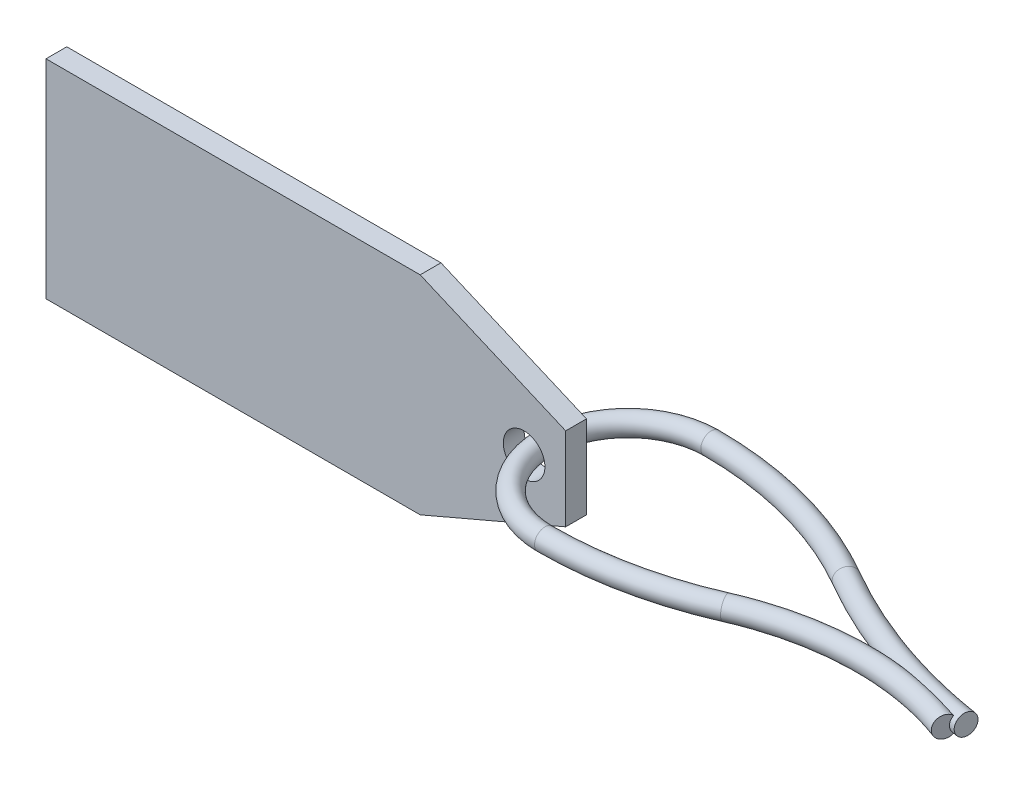
ISO-10303-21;
HEADER;
FILE_DESCRIPTION(('STEP AP214'),'2;1');
FILE_NAME('part.step','',(''),(''),'','','');
FILE_SCHEMA(('AUTOMOTIVE_DESIGN { 1 0 10303 214 1 1 1 1 }'));
ENDSEC;
DATA;
#1=APPLICATION_CONTEXT('core data for automotive mechanical design processes');
#2=APPLICATION_PROTOCOL_DEFINITION('international standard','automotive_design',2000,#1);
#3=PRODUCT_CONTEXT('',#1,'mechanical');
#4=PRODUCT('Part','Part','',(#3));
#5=PRODUCT_RELATED_PRODUCT_CATEGORY('part','',(#4));
#6=PRODUCT_DEFINITION_FORMATION('','',#4);
#7=PRODUCT_DEFINITION_CONTEXT('part definition',#1,'design');
#8=PRODUCT_DEFINITION('design','',#6,#7);
#9=PRODUCT_DEFINITION_SHAPE('','',#8);
#10=(LENGTH_UNIT() NAMED_UNIT(*) SI_UNIT(.MILLI.,.METRE.));
#11=(NAMED_UNIT(*) PLANE_ANGLE_UNIT() SI_UNIT($,.RADIAN.));
#12=(NAMED_UNIT(*) SI_UNIT($,.STERADIAN.) SOLID_ANGLE_UNIT());
#13=UNCERTAINTY_MEASURE_WITH_UNIT(LENGTH_MEASURE(1.E-05),#10,'distance_accuracy_value','');
#14=(GEOMETRIC_REPRESENTATION_CONTEXT(3) GLOBAL_UNCERTAINTY_ASSIGNED_CONTEXT((#13)) GLOBAL_UNIT_ASSIGNED_CONTEXT((#10,
#11,#12)) REPRESENTATION_CONTEXT('',''));
#15=CARTESIAN_POINT('',(0.,0.,0.));
#16=DIRECTION('',(0.,0.,1.));
#17=DIRECTION('',(1.,0.,0.));
#18=AXIS2_PLACEMENT_3D('',#15,#16,#17);
#19=CARTESIAN_POINT('',(2.22207402611671,0.,0.11062289535685));
#20=DIRECTION('',(-0.93712421543822,0.,-0.348995995448804));
#21=DIRECTION('',(-0.348995995448804,0.,0.937124215438219));
#22=AXIS2_PLACEMENT_3D('',#19,#20,#21);
#23=PLANE('',#22);
#24=CARTESIAN_POINT('',(2.22207402611671,0.,0.11062289535685));
#25=DIRECTION('',(-0.93712421543822,0.,-0.348995995448804));
#26=DIRECTION('',(-0.348995995448804,0.,0.937124215438219));
#27=AXIS2_PLACEMENT_3D('',#24,#25,#26);
#28=CIRCLE('',#27,0.0250000000000001);
#29=CARTESIAN_POINT('',(2.22802221978477,-0.0182896487932847,0.0946508028481814));
#30=VERTEX_POINT('',#29);
#31=CARTESIAN_POINT('',(2.21334912623049,0.,0.134051000742805));
#32=VERTEX_POINT('',#31);
#33=EDGE_CURVE('E116',#30,#32,#28,.T.);
#34=ORIENTED_EDGE('',*,*,#33,.F.);
#35=CARTESIAN_POINT('',(2.23087340833722,-0.0233163071591965,0.0869947899708942));
#36=CARTESIAN_POINT('',(2.23040681657023,-0.0228096398123458,0.0882476824088545));
#37=CARTESIAN_POINT('',(2.22995526973497,-0.0221894636718635,0.0894601761888313));
#38=CARTESIAN_POINT('',(2.22909446823082,-0.0207425256718293,0.0917716008032897));
#39=CARTESIAN_POINT('',(2.22868521381847,-0.019915762559186,0.0928705309488729));
#40=CARTESIAN_POINT('',(2.22792087490171,-0.0180752932638148,0.0949229341771044));
#41=CARTESIAN_POINT('',(2.22756583757259,-0.0170614259529926,0.0958762805846235));
#42=CARTESIAN_POINT('',(2.22692127729375,-0.0148757588285055,0.0976070541565052));
#43=CARTESIAN_POINT('',(2.2266317250467,-0.0137040300162734,0.0983845599900453));
#44=CARTESIAN_POINT('',(2.22613027827161,-0.0112512064899787,0.0997310451125618));
#45=CARTESIAN_POINT('',(2.22591744526003,-0.00997168759865073,0.100302544418003));
#46=CARTESIAN_POINT('',(2.22557104625364,-0.00732710677344508,0.101232695197151));
#47=CARTESIAN_POINT('',(2.22543748904615,-0.00596203537505113,0.101591323075167));
#48=CARTESIAN_POINT('',(2.22525539651009,-0.00320765201310334,0.102080278040909));
#49=CARTESIAN_POINT('',(2.22520559950386,-0.00181902405637955,0.102213992986057));
#50=CARTESIAN_POINT('',(2.22518867443194,0.000962240386933801,0.102259440197366));
#51=CARTESIAN_POINT('',(2.2252215369689,0.00235487639987942,0.102171197697242));
#52=CARTESIAN_POINT('',(2.22536838691484,0.00509521390567902,0.101776876151527));
#53=CARTESIAN_POINT('',(2.22548184460052,0.00644314897044404,0.101472219519182));
#54=CARTESIAN_POINT('',(2.22578577191809,0.00906559262209182,0.100656113739341));
#55=CARTESIAN_POINT('',(2.22597623725238,0.010340105301951,0.100144676131747));
#56=CARTESIAN_POINT('',(2.22642937814269,0.0127860864028449,0.0989279019943625));
#57=CARTESIAN_POINT('',(2.22669236756182,0.0139570770371507,0.0982217226791622));
#58=CARTESIAN_POINT('',(2.2272824907289,0.0161586750933333,0.0966371236660725));
#59=CARTESIAN_POINT('',(2.22760965715082,0.0171892105514334,0.0957586162320165));
#60=CARTESIAN_POINT('',(2.22832366397658,0.019096116082542,0.0938413647588337));
#61=CARTESIAN_POINT('',(2.22871130270481,0.0199700273423745,0.092800477058696));
#62=CARTESIAN_POINT('',(2.22953103493677,0.0215211297197239,0.0905993316737437));
#63=CARTESIAN_POINT('',(2.22996304145559,0.0221986961716467,0.0894393075608793));
#64=CARTESIAN_POINT('',(2.23056336019936,0.022964624973904,0.0878273313803483));
#65=CARTESIAN_POINT('',(2.23071759301843,0.0231467781857187,0.0874131853401245));
#66=CARTESIAN_POINT('',(2.23087340833722,0.0233163071591965,0.0869947899708942));
#67=B_SPLINE_CURVE_WITH_KNOTS('',3,(#35,#36,#37,#38,#39,#40,#41,#42,#43,#44,#45,#46,#47,#48,#49,
#50,#51,#52,#53,#54,#55,#56,#57,#58,#59,#60,#61,#62,#63,#64,#65,#66),.UNSPECIFIED.,.F.,.F.,(4,2,
2,2,2,2,2,2,2,2,2,2,2,2,2,4),(0.,0.00428421897132209,0.00856846392999558,0.0128564157061114,
0.01714244528707,0.0213741073748784,0.0256062384328563,0.0297740305320487,0.0339413488281236,
0.0380815272707202,0.0422214746927172,0.0463796276446126,0.0505399031272524,0.0547606550369563,
0.0589732844763933,0.0604064637211911),.UNSPECIFIED.);
#68=CARTESIAN_POINT('',(2.22802221975927,0.0182896487956004,0.094650802841335));
#69=VERTEX_POINT('',#68);
#70=EDGE_CURVE('E12',#30,#69,#67,.T.);
#71=ORIENTED_EDGE('',*,*,#70,.T.);
#72=EDGE_CURVE('E114',#32,#69,#28,.T.);
#73=ORIENTED_EDGE('',*,*,#72,.F.);
#74=EDGE_LOOP('',(#34,#71,#73));
#75=FACE_BOUND('',#74,.T.);
#76=ADVANCED_FACE('F43',(#75),#23,.F.);
#77=CARTESIAN_POINT('',(2.24288145491015,0.,0.0798279007425472));
#78=DIRECTION('',(0.987419589856758,0.,0.158121957890456));
#79=DIRECTION('',(0.158121957890456,0.,-0.987419589856758));
#80=AXIS2_PLACEMENT_3D('',#77,#78,#79);
#81=PLANE('',#80);
#82=CARTESIAN_POINT('',(2.24288145491015,0.,0.0798279007425472));
#83=DIRECTION('',(0.987419589856758,0.,0.158121957890456));
#84=DIRECTION('',(0.158121957890456,0.,-0.987419589856758));
#85=AXIS2_PLACEMENT_3D('',#82,#83,#84);
#86=CIRCLE('',#85,0.0250000000000001);
#87=CARTESIAN_POINT('',(2.24683450385741,0.,0.0551424109961281));
#88=VERTEX_POINT('',#87);
#89=EDGE_CURVE('E69',#88,#88,#86,.T.);
#90=ORIENTED_EDGE('',*,*,#89,.T.);
#91=EDGE_LOOP('',(#90));
#92=FACE_BOUND('',#91,.T.);
#93=ADVANCED_FACE('F70',(#92),#81,.T.);
#94=CARTESIAN_POINT('',(1.98364453761731,0.,0.750853872964479));
#95=DIRECTION('',(0.,1.,0.));
#96=DIRECTION('',(0.,0.,1.));
#97=AXIS2_PLACEMENT_3D('',#94,#95,#96);
#98=TOROIDAL_SURFACE('',#97,0.683186889272991,0.0250000000000001);
#99=CARTESIAN_POINT('',(1.7102112777979,0.,0.124771946936394));
#100=DIRECTION('',(-0.916413847892084,0.,0.400232006955496));
#101=DIRECTION('',(0.400232006955495,0.,0.916413847892084));
#102=AXIS2_PLACEMENT_3D('',#99,#100,#101);
#103=CIRCLE('',#102,0.0250000000000001);
#104=CARTESIAN_POINT('',(1.72021707797178,0.,0.147682293133697));
#105=VERTEX_POINT('',#104);
#106=EDGE_CURVE('E109',#105,#105,#103,.T.);
#107=ORIENTED_EDGE('',*,*,#106,.F.);
#108=EDGE_LOOP('',(#107));
#109=FACE_BOUND('',#108,.T.);
#110=ORIENTED_EDGE('',*,*,#72,.T.);
#111=CARTESIAN_POINT('',(2.23099892600287,0.0180102172105584,0.0954517286795699));
#112=CARTESIAN_POINT('',(2.22297851913903,0.0187742771963949,0.0932892189895977));
#113=CARTESIAN_POINT('',(2.21493672422997,0.0193591324455085,0.0911567621427721));
#114=CARTESIAN_POINT('',(2.19881926662004,0.0202656547503458,0.0869549239701692));
#115=CARTESIAN_POINT('',(2.19074359615363,0.0205872577242473,0.0848855581201853));
#116=CARTESIAN_POINT('',(2.16648337585566,0.0212997455349004,0.0787776993321519));
#117=CARTESIAN_POINT('',(2.15026724944211,0.0214381927861168,0.0748398854995386));
#118=CARTESIAN_POINT('',(2.11777242128197,0.0211964238366958,0.0672392821928734));
#119=CARTESIAN_POINT('',(2.1014937261859,0.0208162613183142,0.063576464294888));
#120=CARTESIAN_POINT('',(2.07705992999792,0.0195485516812121,0.0582930997953305));
#121=CARTESIAN_POINT('',(2.06890952188115,0.0190093907765079,0.0565664894149794));
#122=CARTESIAN_POINT('',(2.05262764500638,0.0175582881908228,0.0531879145261122));
#123=CARTESIAN_POINT('',(2.04449616531641,0.0166467455714527,0.0515358722051105));
#124=CARTESIAN_POINT('',(2.03235951881656,0.0147188897821682,0.0491213594788692));
#125=CARTESIAN_POINT('',(2.02831624154659,0.0139808577822698,0.0483256246389698));
#126=CARTESIAN_POINT('',(2.02028910525771,0.0122057315520664,0.0467626642366604));
#127=CARTESIAN_POINT('',(2.01630511979793,0.0111694142505922,0.0459953703819447));
#128=CARTESIAN_POINT('',(2.01099669720046,0.00929964367048644,0.0449834688504507));
#129=CARTESIAN_POINT('',(2.00957857451313,0.00874997419653119,0.0447142180862233));
#130=CARTESIAN_POINT('',(2.00679467124756,0.00750349962060467,0.0441876331162642));
#131=CARTESIAN_POINT('',(2.00542903520753,0.00680631843216512,0.0439303314599767));
#132=CARTESIAN_POINT('',(2.00349296531393,0.00555676528256601,0.0435667849128657));
#133=CARTESIAN_POINT('',(2.00286238541125,0.00510242415588908,0.0434486007627976));
#134=CARTESIAN_POINT('',(2.00168670361012,0.00409261457143658,0.0432285974982279));
#135=CARTESIAN_POINT('',(2.00114073486289,0.0035383179782491,0.0431266121128821));
#136=CARTESIAN_POINT('',(2.00053055064648,0.00269200866775631,0.0430127555277456));
#137=CARTESIAN_POINT('',(2.0003835123898,0.00246298694639095,0.0429853328224205));
#138=CARTESIAN_POINT('',(2.00012194582078,0.0019860517933643,0.0429365659561381));
#139=CARTESIAN_POINT('',(2.00000741592711,0.00173813928136681,0.0429152214995117));
#140=CARTESIAN_POINT('',(1.99981994999131,0.00122236564166759,0.0428802914763274));
#141=CARTESIAN_POINT('',(1.99974757266941,0.000954287490050669,0.0428668101297355));
#142=CARTESIAN_POINT('',(1.99965672842839,0.000408913693186114,0.0428498899253072));
#143=CARTESIAN_POINT('',(1.99963816728146,0.000131635019651929,0.0428464335146107));
#144=CARTESIAN_POINT('',(1.99965630498528,-0.000383747991669658,0.0428498114694946));
#145=CARTESIAN_POINT('',(1.99968595963135,-0.000622141899911959,0.0428553340278263));
#146=CARTESIAN_POINT('',(1.99978410936124,-0.00109051630885416,0.0428736159518319));
#147=CARTESIAN_POINT('',(1.99985264455164,-0.00132048786042882,0.0428863827902265));
#148=CARTESIAN_POINT('',(2.00005299311792,-0.00184921260133489,0.0429237147436627));
#149=CARTESIAN_POINT('',(2.00019877424877,-0.00214241951476966,0.0429508857077726));
#150=CARTESIAN_POINT('',(2.00053331823746,-0.00270208655205836,0.0430132716527137));
#151=CARTESIAN_POINT('',(2.00072218660114,-0.00296847866880936,0.0430485063796159));
#152=CARTESIAN_POINT('',(2.00129506334142,-0.00368379833448852,0.0431554471463316));
#153=CARTESIAN_POINT('',(2.00171263847385,-0.00410450047766728,0.0432334695649547));
#154=CARTESIAN_POINT('',(2.00259941433616,-0.00488440272089546,0.0433993762715908));
#155=CARTESIAN_POINT('',(2.00306877644679,-0.00524340110994317,0.0434872914056174));
#156=CARTESIAN_POINT('',(2.00510938105796,-0.00666770342347686,0.0438700577563083));
#157=CARTESIAN_POINT('',(2.00681251758544,-0.00753074533301569,0.0441908251443441));
#158=CARTESIAN_POINT('',(2.01030288604275,-0.0090517248248915,0.0448514582871433));
#159=CARTESIAN_POINT('',(2.01209061219875,-0.0097082237653764,0.0451914393519382));
#160=CARTESIAN_POINT('',(2.0180059684076,-0.0116519629179384,0.046322037127494));
#161=CARTESIAN_POINT('',(2.02221541990178,-0.0126783486564194,0.0471353987123194));
#162=CARTESIAN_POINT('',(2.03069179513114,-0.0144335202625157,0.0487921560337347));
#163=CARTESIAN_POINT('',(2.03495885520265,-0.0151613869472202,0.0496356359694974));
#164=CARTESIAN_POINT('',(2.04779758859019,-0.0170605259300855,0.0522024987022706));
#165=CARTESIAN_POINT('',(2.05640465774245,-0.0179468208771186,0.0539618927630844));
#166=CARTESIAN_POINT('',(2.07868156090756,-0.0197584102097331,0.0586181014631358));
#167=CARTESIAN_POINT('',(2.09235657190444,-0.0204010214524162,0.0615761768836492));
#168=CARTESIAN_POINT('',(2.11969314383069,-0.0212113498724486,0.0676920279871474));
#169=CARTESIAN_POINT('',(2.13335466269883,-0.0213784344674607,0.0708500639731389));
#170=CARTESIAN_POINT('',(2.16059251882874,-0.0213336156854961,0.077350337787055));
#171=CARTESIAN_POINT('',(2.17416898670372,-0.0211227416629275,0.0806920513582934));
#172=CARTESIAN_POINT('',(2.20125222968485,-0.0202059703070565,0.0875612778153912));
#173=CARTESIAN_POINT('',(2.2147590598083,-0.0195005555123061,0.091088606490395));
#174=CARTESIAN_POINT('',(2.22913145364915,-0.0181884496969377,0.0949487131084234));
#175=CARTESIAN_POINT('',(2.23006536259469,-0.0181006395411552,0.0952000251704695));
#176=CARTESIAN_POINT('',(2.23099892600287,-0.0180102172105584,0.0954517286795698));
#177=B_SPLINE_CURVE_WITH_KNOTS('',3,(#111,#112,#113,#114,#115,#116,#117,#118,#119,#120,#121,
#122,#123,#124,#125,#126,#127,#128,#129,#130,#131,#132,#133,#134,#135,#136,#137,#138,#139,#140,
#141,#142,#143,#144,#145,#146,#147,#148,#149,#150,#151,#152,#153,#154,#155,#156,#157,#158,#159,
#160,#161,#162,#163,#164,#165,#166,#167,#168,#169,#170,#171,#172,#173,#174,#175,#176),
.UNSPECIFIED.,.F.,.F.,(4,2,2,2,2,2,2,2,2,2,2,2,2,2,2,2,2,2,2,2,2,2,2,2,2,2,2,2,2,2,2,2,4),(0.,
0.0250184675674639,0.0500430234113517,0.100097213106681,0.150146221993437,0.175190281099028,
0.20020757193445,0.212765283060834,0.225290577229924,0.2299218272997,0.234565030339268,
0.236919368822319,0.239247714497164,0.240066273789794,0.240884793257782,0.241713928586328,
0.242541611286297,0.243258834602522,0.243976799107414,0.244956919256898,0.245939465645984,
0.247722972659009,0.249512203465207,0.255275486349784,0.261078066537529,0.274266843638828,
0.28749593137853,0.313960851125477,0.35596559431908,0.398026189412635,0.439972408246839,
0.481877755733372,0.484791079370724),.UNSPECIFIED.);
#178=EDGE_CURVE('E55',#69,#30,#177,.T.);
#179=ORIENTED_EDGE('',*,*,#178,.T.);
#180=ORIENTED_EDGE('',*,*,#33,.T.);
#181=EDGE_LOOP('',(#110,#179,#180));
#182=FACE_BOUND('',#181,.T.);
#183=ADVANCED_FACE('F85',(#109,#182),#98,.T.);
#184=CARTESIAN_POINT('',(1.35,0.,-0.700006175263118));
#185=DIRECTION('',(0.,-1.,0.));
#186=DIRECTION('',(0.,0.,-1.));
#187=AXIS2_PLACEMENT_3D('',#184,#185,#186);
#188=TOROIDAL_SURFACE('',#187,0.900006175263118,0.0250000000000001);
#189=CARTESIAN_POINT('',(1.35,0.,0.2));
#190=DIRECTION('',(-1.,0.,0.));
#191=DIRECTION('',(0.,0.,1.));
#192=AXIS2_PLACEMENT_3D('',#189,#190,#191);
#193=CIRCLE('',#192,0.0250000000000001);
#194=CARTESIAN_POINT('',(1.35,0.,0.225));
#195=VERTEX_POINT('',#194);
#196=EDGE_CURVE('E107',#195,#195,#193,.T.);
#197=CARTESIAN_POINT('',(1.35,0.,-0.700006175263118));
#198=DIRECTION('',(0.,-1.,0.));
#199=DIRECTION('',(0.,0.,-1.));
#200=AXIS2_PLACEMENT_3D('',#197,#198,#199);
#201=CIRCLE('',#200,0.925006175263118);
#202=EDGE_CURVE('',#105,#195,#201,.T.);
#203=ORIENTED_EDGE('',*,*,#106,.T.);
#204=ORIENTED_EDGE('',*,*,#196,.F.);
#205=ORIENTED_EDGE('',*,*,#202,.T.);
#206=ORIENTED_EDGE('',*,*,#202,.F.);
#207=EDGE_LOOP('',(#203,#205,#204,#206));
#208=FACE_BOUND('',#207,.T.);
#209=ADVANCED_FACE('F89',(#208),#188,.T.);
#210=CARTESIAN_POINT('',(1.35,0.,0.));
#211=DIRECTION('',(0.,-1.,0.));
#212=DIRECTION('',(0.,0.,-1.));
#213=AXIS2_PLACEMENT_3D('',#210,#211,#212);
#214=TOROIDAL_SURFACE('',#213,0.2,0.0250000000000001);
#215=CARTESIAN_POINT('',(1.35,0.,-0.2));
#216=DIRECTION('',(1.,0.,0.));
#217=DIRECTION('',(0.,0.,-1.));
#218=AXIS2_PLACEMENT_3D('',#215,#216,#217);
#219=CIRCLE('',#218,0.0250000000000001);
#220=CARTESIAN_POINT('',(1.35,0.,-0.225));
#221=VERTEX_POINT('',#220);
#222=EDGE_CURVE('E75',#221,#221,#219,.T.);
#223=CARTESIAN_POINT('',(1.35,0.,0.));
#224=DIRECTION('',(0.,-1.,0.));
#225=DIRECTION('',(0.,0.,-1.));
#226=AXIS2_PLACEMENT_3D('',#223,#224,#225);
#227=CIRCLE('',#226,0.225);
#228=EDGE_CURVE('',#195,#221,#227,.T.);
#229=ORIENTED_EDGE('',*,*,#196,.T.);
#230=ORIENTED_EDGE('',*,*,#222,.F.);
#231=ORIENTED_EDGE('',*,*,#228,.T.);
#232=ORIENTED_EDGE('',*,*,#228,.F.);
#233=EDGE_LOOP('',(#229,#231,#230,#232));
#234=FACE_BOUND('',#233,.T.);
#235=ADVANCED_FACE('F93',(#234),#214,.T.);
#236=CARTESIAN_POINT('',(1.35,0.,0.685324542818302));
#237=DIRECTION('',(0.,-1.,0.));
#238=DIRECTION('',(0.,0.,-1.));
#239=AXIS2_PLACEMENT_3D('',#236,#237,#238);
#240=TOROIDAL_SURFACE('',#239,0.885324542818302,0.0250000000000001);
#241=CARTESIAN_POINT('',(1.79510558727516,0.,-0.07997315239113));
#242=DIRECTION('',(0.86442616034705,0.,0.502759796829119));
#243=DIRECTION('',(0.502759796829119,0.,-0.86442616034705));
#244=AXIS2_PLACEMENT_3D('',#241,#242,#243);
#245=CIRCLE('',#244,0.0250000000000001);
#246=CARTESIAN_POINT('',(1.80767458219589,0.,-0.101583806399806));
#247=VERTEX_POINT('',#246);
#248=EDGE_CURVE('E72',#247,#247,#245,.T.);
#249=CARTESIAN_POINT('',(1.35,0.,0.685324542818302));
#250=DIRECTION('',(0.,-1.,0.));
#251=DIRECTION('',(0.,0.,-1.));
#252=AXIS2_PLACEMENT_3D('',#249,#250,#251);
#253=CIRCLE('',#252,0.910324542818302);
#254=EDGE_CURVE('',#221,#247,#253,.T.);
#255=ORIENTED_EDGE('',*,*,#222,.T.);
#256=ORIENTED_EDGE('',*,*,#248,.F.);
#257=ORIENTED_EDGE('',*,*,#254,.T.);
#258=ORIENTED_EDGE('',*,*,#254,.F.);
#259=EDGE_LOOP('',(#255,#257,#256,#258));
#260=FACE_BOUND('',#259,.T.);
#261=ADVANCED_FACE('F96',(#260),#240,.T.);
#262=CARTESIAN_POINT('',(2.44832377402574,0.,-1.20309177206386));
#263=DIRECTION('',(0.,1.,0.));
#264=DIRECTION('',(0.,0.,1.));
#265=AXIS2_PLACEMENT_3D('',#262,#263,#264);
#266=TOROIDAL_SURFACE('',#265,1.29926495887378,0.0250000000000001);
#267=ORIENTED_EDGE('',*,*,#70,.F.);
#268=ORIENTED_EDGE('',*,*,#178,.F.);
#269=EDGE_LOOP('',(#267,#268));
#270=FACE_BOUND('',#269,.T.);
#271=ORIENTED_EDGE('',*,*,#89,.F.);
#272=EDGE_LOOP('',(#271));
#273=FACE_BOUND('',#272,.T.);
#274=ORIENTED_EDGE('',*,*,#248,.T.);
#275=EDGE_LOOP('',(#274));
#276=FACE_BOUND('',#275,.T.);
#277=ADVANCED_FACE('F82',(#270,#273,#276),#266,.T.);
#278=CLOSED_SHELL('',(#76,#93,#183,#209,#235,#261,#277));
#279=MANIFOLD_SOLID_BREP('B2',#278);
#280=CARTESIAN_POINT('',(0.,0.25,0.05));
#281=DIRECTION('',(0.,-1.,0.));
#282=DIRECTION('',(0.,0.,-1.));
#283=AXIS2_PLACEMENT_3D('',#280,#281,#282);
#284=PLANE('',#283);
#285=DIRECTION('',(-1.,0.,0.));
#286=VECTOR('',#285,1.);
#287=CARTESIAN_POINT('',(0.,0.25,0.));
#288=LINE('',#287,#286);
#289=CARTESIAN_POINT('',(0.9,0.25,0.));
#290=VERTEX_POINT('',#289);
#291=CARTESIAN_POINT('',(0.,0.25,0.));
#292=VERTEX_POINT('',#291);
#293=EDGE_CURVE('E256',#290,#292,#288,.T.);
#294=ORIENTED_EDGE('',*,*,#293,.T.);
#295=DIRECTION('',(0.,0.,-1.));
#296=VECTOR('',#295,1.);
#297=CARTESIAN_POINT('',(0.,0.25,0.05));
#298=LINE('',#297,#296);
#299=CARTESIAN_POINT('',(0.,0.25,0.05));
#300=VERTEX_POINT('',#299);
#301=EDGE_CURVE('E41',#300,#292,#298,.T.);
#302=ORIENTED_EDGE('',*,*,#301,.F.);
#303=DIRECTION('',(-1.,0.,0.));
#304=VECTOR('',#303,1.);
#305=CARTESIAN_POINT('',(0.,0.25,0.05));
#306=LINE('',#305,#304);
#307=CARTESIAN_POINT('',(0.9,0.25,0.05));
#308=VERTEX_POINT('',#307);
#309=EDGE_CURVE('E267',#308,#300,#306,.T.);
#310=ORIENTED_EDGE('',*,*,#309,.F.);
#311=DIRECTION('',(0.,0.,-1.));
#312=VECTOR('',#311,1.);
#313=CARTESIAN_POINT('',(0.9,0.25,0.05));
#314=LINE('',#313,#312);
#315=EDGE_CURVE('E252',#308,#290,#314,.T.);
#316=ORIENTED_EDGE('',*,*,#315,.T.);
#317=EDGE_LOOP('',(#294,#302,#310,#316));
#318=FACE_BOUND('',#317,.T.);
#319=ADVANCED_FACE('F172',(#318),#284,.F.);
#320=CARTESIAN_POINT('',(0.,-0.25,0.05));
#321=DIRECTION('',(1.,0.,0.));
#322=DIRECTION('',(0.,0.,-1.));
#323=AXIS2_PLACEMENT_3D('',#320,#321,#322);
#324=PLANE('',#323);
#325=DIRECTION('',(0.,-1.,0.));
#326=VECTOR('',#325,1.);
#327=CARTESIAN_POINT('',(0.,-0.25,0.));
#328=LINE('',#327,#326);
#329=CARTESIAN_POINT('',(0.,-0.25,0.));
#330=VERTEX_POINT('',#329);
#331=EDGE_CURVE('E259',#292,#330,#328,.T.);
#332=ORIENTED_EDGE('',*,*,#331,.T.);
#333=DIRECTION('',(0.,0.,-1.));
#334=VECTOR('',#333,1.);
#335=CARTESIAN_POINT('',(0.,-0.25,0.05));
#336=LINE('',#335,#334);
#337=CARTESIAN_POINT('',(0.,-0.25,0.05));
#338=VERTEX_POINT('',#337);
#339=EDGE_CURVE('E180',#338,#330,#336,.T.);
#340=ORIENTED_EDGE('',*,*,#339,.F.);
#341=DIRECTION('',(0.,-1.,0.));
#342=VECTOR('',#341,1.);
#343=CARTESIAN_POINT('',(0.,-0.25,0.05));
#344=LINE('',#343,#342);
#345=EDGE_CURVE('E225',#300,#338,#344,.T.);
#346=ORIENTED_EDGE('',*,*,#345,.F.);
#347=ORIENTED_EDGE('',*,*,#301,.T.);
#348=EDGE_LOOP('',(#332,#340,#346,#347));
#349=FACE_BOUND('',#348,.T.);
#350=ADVANCED_FACE('F292',(#349),#324,.F.);
#351=CARTESIAN_POINT('',(0.,-0.25,0.05));
#352=DIRECTION('',(0.,1.,0.));
#353=DIRECTION('',(0.,0.,1.));
#354=AXIS2_PLACEMENT_3D('',#351,#352,#353);
#355=PLANE('',#354);
#356=DIRECTION('',(1.,0.,0.));
#357=VECTOR('',#356,1.);
#358=CARTESIAN_POINT('',(0.,-0.25,0.));
#359=LINE('',#358,#357);
#360=CARTESIAN_POINT('',(0.9,-0.25,0.));
#361=VERTEX_POINT('',#360);
#362=EDGE_CURVE('E262',#330,#361,#359,.T.);
#363=ORIENTED_EDGE('',*,*,#362,.T.);
#364=DIRECTION('',(0.,0.,-1.));
#365=VECTOR('',#364,1.);
#366=CARTESIAN_POINT('',(0.9,-0.25,0.05));
#367=LINE('',#366,#365);
#368=CARTESIAN_POINT('',(0.9,-0.25,0.05));
#369=VERTEX_POINT('',#368);
#370=EDGE_CURVE('E247',#369,#361,#367,.T.);
#371=ORIENTED_EDGE('',*,*,#370,.F.);
#372=DIRECTION('',(1.,0.,0.));
#373=VECTOR('',#372,1.);
#374=CARTESIAN_POINT('',(0.,-0.25,0.05));
#375=LINE('',#374,#373);
#376=EDGE_CURVE('E238',#338,#369,#375,.T.);
#377=ORIENTED_EDGE('',*,*,#376,.F.);
#378=ORIENTED_EDGE('',*,*,#339,.T.);
#379=EDGE_LOOP('',(#363,#371,#377,#378));
#380=FACE_BOUND('',#379,.T.);
#381=ADVANCED_FACE('F273',(#380),#355,.F.);
#382=CARTESIAN_POINT('',(0.9,-0.25,0.05));
#383=DIRECTION('',(-0.393919298579168,0.919145030018058,0.));
#384=DIRECTION('',(-0.919145030018058,-0.393919298579168,0.));
#385=AXIS2_PLACEMENT_3D('',#382,#383,#384);
#386=PLANE('',#385);
#387=DIRECTION('',(0.919145030018058,0.393919298579168,0.));
#388=VECTOR('',#387,1.);
#389=CARTESIAN_POINT('',(0.9,-0.25,0.));
#390=LINE('',#389,#388);
#391=CARTESIAN_POINT('',(1.25,-0.1,0.));
#392=VERTEX_POINT('',#391);
#393=EDGE_CURVE('E246',#361,#392,#390,.T.);
#394=ORIENTED_EDGE('',*,*,#393,.T.);
#395=DIRECTION('',(0.,0.,-1.));
#396=VECTOR('',#395,1.);
#397=CARTESIAN_POINT('',(1.25,-0.1,0.05));
#398=LINE('',#397,#396);
#399=CARTESIAN_POINT('',(1.25,-0.1,0.05));
#400=VERTEX_POINT('',#399);
#401=EDGE_CURVE('E243',#400,#392,#398,.T.);
#402=ORIENTED_EDGE('',*,*,#401,.F.);
#403=DIRECTION('',(0.919145030018058,0.393919298579168,0.));
#404=VECTOR('',#403,1.);
#405=CARTESIAN_POINT('',(0.9,-0.25,0.05));
#406=LINE('',#405,#404);
#407=EDGE_CURVE('E232',#369,#400,#406,.T.);
#408=ORIENTED_EDGE('',*,*,#407,.F.);
#409=ORIENTED_EDGE('',*,*,#370,.T.);
#410=EDGE_LOOP('',(#394,#402,#408,#409));
#411=FACE_BOUND('',#410,.T.);
#412=ADVANCED_FACE('F244',(#411),#386,.F.);
#413=CARTESIAN_POINT('',(1.25,0.1,0.05));
#414=DIRECTION('',(-1.,0.,0.));
#415=DIRECTION('',(0.,0.,1.));
#416=AXIS2_PLACEMENT_3D('',#413,#414,#415);
#417=PLANE('',#416);
#418=DIRECTION('',(0.,1.,0.));
#419=VECTOR('',#418,1.);
#420=CARTESIAN_POINT('',(1.25,0.1,0.));
#421=LINE('',#420,#419);
#422=CARTESIAN_POINT('',(1.25,0.1,0.));
#423=VERTEX_POINT('',#422);
#424=EDGE_CURVE('E211',#392,#423,#421,.T.);
#425=ORIENTED_EDGE('',*,*,#424,.T.);
#426=DIRECTION('',(0.,0.,-1.));
#427=VECTOR('',#426,1.);
#428=CARTESIAN_POINT('',(1.25,0.1,0.05));
#429=LINE('',#428,#427);
#430=CARTESIAN_POINT('',(1.25,0.1,0.05));
#431=VERTEX_POINT('',#430);
#432=EDGE_CURVE('E248',#431,#423,#429,.T.);
#433=ORIENTED_EDGE('',*,*,#432,.F.);
#434=DIRECTION('',(0.,1.,0.));
#435=VECTOR('',#434,1.);
#436=CARTESIAN_POINT('',(1.25,0.1,0.05));
#437=LINE('',#436,#435);
#438=EDGE_CURVE('E236',#400,#431,#437,.T.);
#439=ORIENTED_EDGE('',*,*,#438,.F.);
#440=ORIENTED_EDGE('',*,*,#401,.T.);
#441=EDGE_LOOP('',(#425,#433,#439,#440));
#442=FACE_BOUND('',#441,.T.);
#443=ADVANCED_FACE('F250',(#442),#417,.F.);
#444=CARTESIAN_POINT('',(0.9,0.25,0.05));
#445=DIRECTION('',(-0.393919298579168,-0.919145030018058,0.));
#446=DIRECTION('',(0.919145030018058,-0.393919298579168,0.));
#447=AXIS2_PLACEMENT_3D('',#444,#445,#446);
#448=PLANE('',#447);
#449=DIRECTION('',(-0.919145030018058,0.393919298579168,0.));
#450=VECTOR('',#449,1.);
#451=CARTESIAN_POINT('',(0.9,0.25,0.));
#452=LINE('',#451,#450);
#453=EDGE_CURVE('E217',#423,#290,#452,.T.);
#454=ORIENTED_EDGE('',*,*,#453,.T.);
#455=ORIENTED_EDGE('',*,*,#315,.F.);
#456=DIRECTION('',(-0.919145030018058,0.393919298579168,0.));
#457=VECTOR('',#456,1.);
#458=CARTESIAN_POINT('',(0.9,0.25,0.05));
#459=LINE('',#458,#457);
#460=EDGE_CURVE('E188',#431,#308,#459,.T.);
#461=ORIENTED_EDGE('',*,*,#460,.F.);
#462=ORIENTED_EDGE('',*,*,#432,.T.);
#463=EDGE_LOOP('',(#454,#455,#461,#462));
#464=FACE_BOUND('',#463,.T.);
#465=ADVANCED_FACE('F280',(#464),#448,.F.);
#466=CARTESIAN_POINT('',(0.,0.,0.05));
#467=DIRECTION('',(0.,0.,-1.));
#468=DIRECTION('',(-1.,0.,0.));
#469=AXIS2_PLACEMENT_3D('',#466,#467,#468);
#470=PLANE('',#469);
#471=CARTESIAN_POINT('',(1.15,0.,0.05));
#472=DIRECTION('',(0.,0.,1.));
#473=DIRECTION('',(1.,0.,0.));
#474=AXIS2_PLACEMENT_3D('',#471,#472,#473);
#475=CIRCLE('',#474,0.0499999999999999);
#476=CARTESIAN_POINT('',(1.2,0.,0.05));
#477=VERTEX_POINT('',#476);
#478=EDGE_CURVE('E347',#477,#477,#475,.T.);
#479=ORIENTED_EDGE('',*,*,#478,.F.);
#480=EDGE_LOOP('',(#479));
#481=FACE_BOUND('',#480,.T.);
#482=ORIENTED_EDGE('',*,*,#309,.T.);
#483=ORIENTED_EDGE('',*,*,#345,.T.);
#484=ORIENTED_EDGE('',*,*,#376,.T.);
#485=ORIENTED_EDGE('',*,*,#407,.T.);
#486=ORIENTED_EDGE('',*,*,#438,.T.);
#487=ORIENTED_EDGE('',*,*,#460,.T.);
#488=EDGE_LOOP('',(#482,#483,#484,#485,#486,#487));
#489=FACE_BOUND('',#488,.T.);
#490=ADVANCED_FACE('F234',(#481,#489),#470,.F.);
#491=CARTESIAN_POINT('',(0.,0.,0.));
#492=DIRECTION('',(0.,0.,-1.));
#493=DIRECTION('',(-1.,0.,0.));
#494=AXIS2_PLACEMENT_3D('',#491,#492,#493);
#495=PLANE('',#494);
#496=CARTESIAN_POINT('',(1.15,0.,0.));
#497=DIRECTION('',(0.,0.,1.));
#498=DIRECTION('',(1.,0.,0.));
#499=AXIS2_PLACEMENT_3D('',#496,#497,#498);
#500=CIRCLE('',#499,0.0499999999999999);
#501=CARTESIAN_POINT('',(1.2,0.,0.));
#502=VERTEX_POINT('',#501);
#503=EDGE_CURVE('E260',#502,#502,#500,.T.);
#504=ORIENTED_EDGE('',*,*,#503,.T.);
#505=EDGE_LOOP('',(#504));
#506=FACE_BOUND('',#505,.T.);
#507=ORIENTED_EDGE('',*,*,#293,.F.);
#508=ORIENTED_EDGE('',*,*,#453,.F.);
#509=ORIENTED_EDGE('',*,*,#424,.F.);
#510=ORIENTED_EDGE('',*,*,#393,.F.);
#511=ORIENTED_EDGE('',*,*,#362,.F.);
#512=ORIENTED_EDGE('',*,*,#331,.F.);
#513=EDGE_LOOP('',(#507,#508,#509,#510,#511,#512));
#514=FACE_BOUND('',#513,.T.);
#515=ADVANCED_FACE('F276',(#506,#514),#495,.T.);
#516=CARTESIAN_POINT('',(1.15,0.,0.));
#517=DIRECTION('',(0.,0.,1.));
#518=DIRECTION('',(1.,0.,0.));
#519=AXIS2_PLACEMENT_3D('',#516,#517,#518);
#520=CYLINDRICAL_SURFACE('',#519,0.0499999999999999);
#521=ORIENTED_EDGE('',*,*,#503,.F.);
#522=EDGE_LOOP('',(#521));
#523=FACE_BOUND('',#522,.T.);
#524=ORIENTED_EDGE('',*,*,#478,.T.);
#525=EDGE_LOOP('',(#524));
#526=FACE_BOUND('',#525,.T.);
#527=ADVANCED_FACE('F329',(#523,#526),#520,.F.);
#528=CLOSED_SHELL('',(#319,#350,#381,#412,#443,#465,#490,#515,#527));
#529=MANIFOLD_SOLID_BREP('B6',#528);
#530=ADVANCED_BREP_SHAPE_REPRESENTATION('',(#18,#279,#529),#14);
#531=SHAPE_DEFINITION_REPRESENTATION(#9,#530);
ENDSEC;
END-ISO-10303-21;
